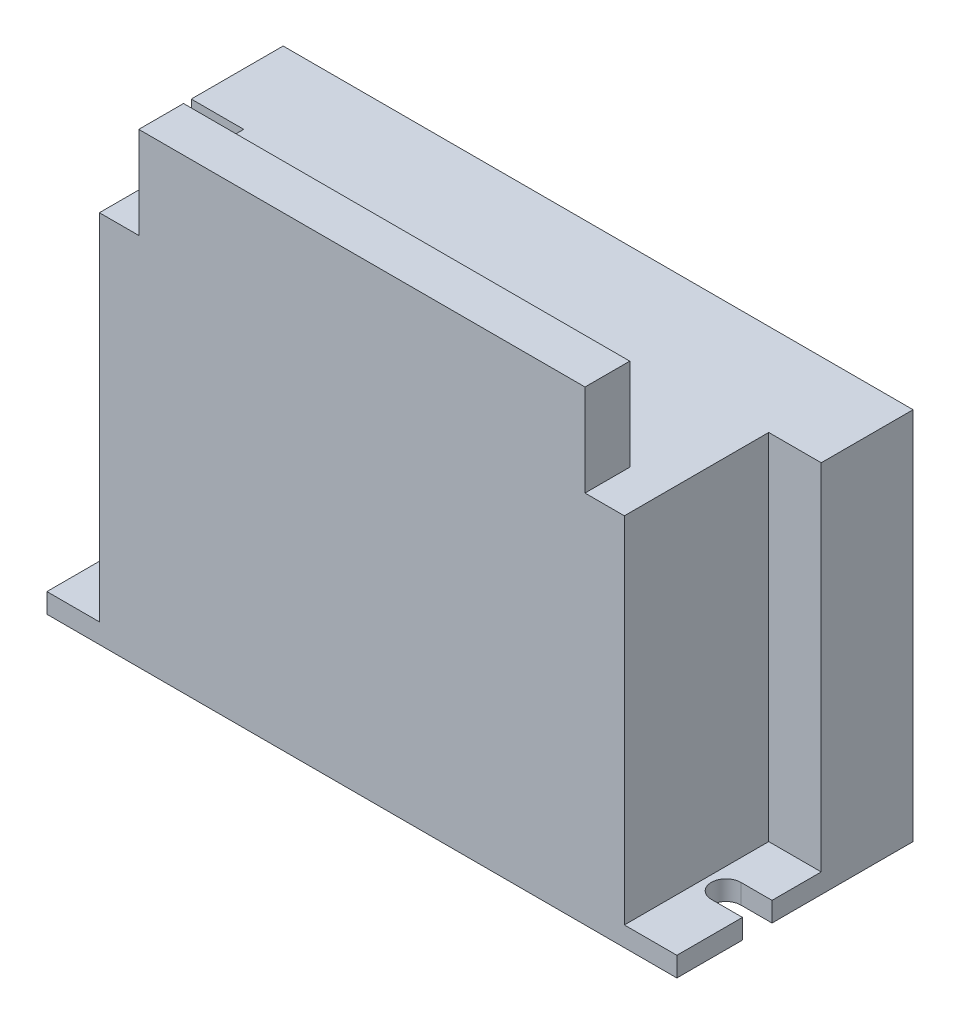
ISO-10303-21;
HEADER;
FILE_DESCRIPTION(('STEP AP214'),'2;1');
FILE_NAME('part.step','',(''),(''),'','','');
FILE_SCHEMA(('AUTOMOTIVE_DESIGN { 1 0 10303 214 1 1 1 1 }'));
ENDSEC;
DATA;
#1=APPLICATION_CONTEXT('core data for automotive mechanical design processes');
#2=APPLICATION_PROTOCOL_DEFINITION('international standard','automotive_design',2000,#1);
#3=PRODUCT_CONTEXT('',#1,'mechanical');
#4=PRODUCT('Part','Part','',(#3));
#5=PRODUCT_RELATED_PRODUCT_CATEGORY('part','',(#4));
#6=PRODUCT_DEFINITION_FORMATION('','',#4);
#7=PRODUCT_DEFINITION_CONTEXT('part definition',#1,'design');
#8=PRODUCT_DEFINITION('design','',#6,#7);
#9=PRODUCT_DEFINITION_SHAPE('','',#8);
#10=(LENGTH_UNIT() NAMED_UNIT(*) SI_UNIT(.MILLI.,.METRE.));
#11=(NAMED_UNIT(*) PLANE_ANGLE_UNIT() SI_UNIT($,.RADIAN.));
#12=(NAMED_UNIT(*) SI_UNIT($,.STERADIAN.) SOLID_ANGLE_UNIT());
#13=UNCERTAINTY_MEASURE_WITH_UNIT(LENGTH_MEASURE(1.E-05),#10,'distance_accuracy_value','');
#14=(GEOMETRIC_REPRESENTATION_CONTEXT(3) GLOBAL_UNCERTAINTY_ASSIGNED_CONTEXT((#13)) GLOBAL_UNIT_ASSIGNED_CONTEXT((#10,
#11,#12)) REPRESENTATION_CONTEXT('',''));
#15=CARTESIAN_POINT('',(0.,0.,0.));
#16=DIRECTION('',(0.,0.,1.));
#17=DIRECTION('',(1.,0.,0.));
#18=AXIS2_PLACEMENT_3D('',#15,#16,#17);
#19=CARTESIAN_POINT('',(-48.,28.5,36.));
#20=DIRECTION('',(0.,-1.,0.));
#21=DIRECTION('',(0.,0.,-1.));
#22=AXIS2_PLACEMENT_3D('',#19,#20,#21);
#23=PLANE('',#22);
#24=DIRECTION('',(0.,0.,-1.));
#25=VECTOR('',#24,1.);
#26=CARTESIAN_POINT('',(34.,28.5,29.1775317753177));
#27=LINE('',#26,#25);
#28=CARTESIAN_POINT('',(34.,28.5,36.));
#29=VERTEX_POINT('',#28);
#30=CARTESIAN_POINT('',(34.,28.5,29.1775317753177));
#31=VERTEX_POINT('',#30);
#32=EDGE_CURVE('E215',#29,#31,#27,.T.);
#33=ORIENTED_EDGE('',*,*,#32,.F.);
#34=DIRECTION('',(-1.,0.,0.));
#35=VECTOR('',#34,1.);
#36=CARTESIAN_POINT('',(-48.,28.5,36.));
#37=LINE('',#36,#35);
#38=CARTESIAN_POINT('',(40.,28.5,36.));
#39=VERTEX_POINT('',#38);
#40=EDGE_CURVE('E366',#39,#29,#37,.T.);
#41=ORIENTED_EDGE('',*,*,#40,.F.);
#42=DIRECTION('',(0.,0.,1.));
#43=VECTOR('',#42,1.);
#44=CARTESIAN_POINT('',(40.,28.5,36.));
#45=LINE('',#44,#43);
#46=CARTESIAN_POINT('',(40.,28.5,14.));
#47=VERTEX_POINT('',#46);
#48=EDGE_CURVE('E341',#47,#39,#45,.T.);
#49=ORIENTED_EDGE('',*,*,#48,.F.);
#50=DIRECTION('',(-1.,0.,0.));
#51=VECTOR('',#50,1.);
#52=CARTESIAN_POINT('',(48.,28.5,14.));
#53=LINE('',#52,#51);
#54=CARTESIAN_POINT('',(48.,28.5,14.));
#55=VERTEX_POINT('',#54);
#56=EDGE_CURVE('E317',#55,#47,#53,.T.);
#57=ORIENTED_EDGE('',*,*,#56,.F.);
#58=DIRECTION('',(0.,0.,-1.));
#59=VECTOR('',#58,1.);
#60=CARTESIAN_POINT('',(48.,28.5,36.));
#61=LINE('',#60,#59);
#62=CARTESIAN_POINT('',(48.,28.5,0.));
#63=VERTEX_POINT('',#62);
#64=EDGE_CURVE('E11',#55,#63,#61,.T.);
#65=ORIENTED_EDGE('',*,*,#64,.T.);
#66=DIRECTION('',(-1.,0.,0.));
#67=VECTOR('',#66,1.);
#68=CARTESIAN_POINT('',(-48.,28.5,0.));
#69=LINE('',#68,#67);
#70=CARTESIAN_POINT('',(-48.,28.5,0.));
#71=VERTEX_POINT('',#70);
#72=EDGE_CURVE('E380',#63,#71,#69,.T.);
#73=ORIENTED_EDGE('',*,*,#72,.T.);
#74=DIRECTION('',(0.,0.,-1.));
#75=VECTOR('',#74,1.);
#76=CARTESIAN_POINT('',(-48.,28.5,36.));
#77=LINE('',#76,#75);
#78=CARTESIAN_POINT('',(-48.,28.5,14.));
#79=VERTEX_POINT('',#78);
#80=EDGE_CURVE('E52',#79,#71,#77,.T.);
#81=ORIENTED_EDGE('',*,*,#80,.F.);
#82=DIRECTION('',(-1.,0.,0.));
#83=VECTOR('',#82,1.);
#84=CARTESIAN_POINT('',(-48.,28.5,14.));
#85=LINE('',#84,#83);
#86=CARTESIAN_POINT('',(-40.,28.5,14.));
#87=VERTEX_POINT('',#86);
#88=EDGE_CURVE('E316',#87,#79,#85,.T.);
#89=ORIENTED_EDGE('',*,*,#88,.F.);
#90=DIRECTION('',(0.,0.,-1.));
#91=VECTOR('',#90,1.);
#92=CARTESIAN_POINT('',(-40.,28.5,36.));
#93=LINE('',#92,#91);
#94=CARTESIAN_POINT('',(-40.,28.5,36.));
#95=VERTEX_POINT('',#94);
#96=EDGE_CURVE('E312',#95,#87,#93,.T.);
#97=ORIENTED_EDGE('',*,*,#96,.F.);
#98=CARTESIAN_POINT('',(-34.,28.5,36.));
#99=VERTEX_POINT('',#98);
#100=EDGE_CURVE('E65',#99,#95,#37,.T.);
#101=ORIENTED_EDGE('',*,*,#100,.F.);
#102=DIRECTION('',(0.,0.,1.));
#103=VECTOR('',#102,1.);
#104=CARTESIAN_POINT('',(-34.,28.5,29.1775317753177));
#105=LINE('',#104,#103);
#106=CARTESIAN_POINT('',(-34.,28.5,29.1775317753177));
#107=VERTEX_POINT('',#106);
#108=EDGE_CURVE('E212',#107,#99,#105,.T.);
#109=ORIENTED_EDGE('',*,*,#108,.F.);
#110=DIRECTION('',(-1.,0.,0.));
#111=VECTOR('',#110,1.);
#112=CARTESIAN_POINT('',(-34.,28.5,29.1775317753177));
#113=LINE('',#112,#111);
#114=EDGE_CURVE('E59',#31,#107,#113,.T.);
#115=ORIENTED_EDGE('',*,*,#114,.F.);
#116=EDGE_LOOP('',(#33,#41,#49,#57,#65,#73,#81,#89,#97,#101,#109,#115));
#117=FACE_BOUND('',#116,.T.);
#118=ADVANCED_FACE('F43',(#117),#23,.F.);
#119=CARTESIAN_POINT('',(-48.,28.5,36.));
#120=DIRECTION('',(1.,0.,0.));
#121=DIRECTION('',(0.,1.,0.));
#122=AXIS2_PLACEMENT_3D('',#119,#120,#121);
#123=PLANE('',#122);
#124=DIRECTION('',(0.,1.,0.));
#125=VECTOR('',#124,1.);
#126=CARTESIAN_POINT('',(-47.9999999999999,-79.5,21.5));
#127=LINE('',#126,#125);
#128=CARTESIAN_POINT('',(-48.,-28.5,21.5));
#129=VERTEX_POINT('',#128);
#130=CARTESIAN_POINT('',(-48.,-25.5,21.5));
#131=VERTEX_POINT('',#130);
#132=EDGE_CURVE('E236',#129,#131,#127,.T.);
#133=ORIENTED_EDGE('',*,*,#132,.T.);
#134=DIRECTION('',(0.,0.,1.));
#135=VECTOR('',#134,1.);
#136=CARTESIAN_POINT('',(-48.,-25.5,36.));
#137=LINE('',#136,#135);
#138=CARTESIAN_POINT('',(-48.,-25.5,14.));
#139=VERTEX_POINT('',#138);
#140=EDGE_CURVE('E294',#139,#131,#137,.T.);
#141=ORIENTED_EDGE('',*,*,#140,.F.);
#142=DIRECTION('',(0.,1.,0.));
#143=VECTOR('',#142,1.);
#144=CARTESIAN_POINT('',(-48.,-25.5,14.));
#145=LINE('',#144,#143);
#146=EDGE_CURVE('E320',#139,#79,#145,.T.);
#147=ORIENTED_EDGE('',*,*,#146,.T.);
#148=ORIENTED_EDGE('',*,*,#80,.T.);
#149=DIRECTION('',(0.,-1.,0.));
#150=VECTOR('',#149,1.);
#151=CARTESIAN_POINT('',(-48.,28.5,0.));
#152=LINE('',#151,#150);
#153=CARTESIAN_POINT('',(-48.,-28.5,0.));
#154=VERTEX_POINT('',#153);
#155=EDGE_CURVE('E384',#71,#154,#152,.T.);
#156=ORIENTED_EDGE('',*,*,#155,.T.);
#157=DIRECTION('',(0.,0.,-1.));
#158=VECTOR('',#157,1.);
#159=CARTESIAN_POINT('',(-48.,-28.5,36.));
#160=LINE('',#159,#158);
#161=EDGE_CURVE('E395',#129,#154,#160,.T.);
#162=ORIENTED_EDGE('',*,*,#161,.F.);
#163=EDGE_LOOP('',(#133,#141,#147,#148,#156,#162));
#164=FACE_BOUND('',#163,.T.);
#165=ADVANCED_FACE('F402',(#164),#123,.F.);
#166=DIRECTION('',(0.,1.,0.));
#167=VECTOR('',#166,1.);
#168=CARTESIAN_POINT('',(-47.9999999999999,-79.5,26.));
#169=LINE('',#168,#167);
#170=CARTESIAN_POINT('',(-48.,-28.5,26.));
#171=VERTEX_POINT('',#170);
#172=CARTESIAN_POINT('',(-48.,-25.5,26.));
#173=VERTEX_POINT('',#172);
#174=EDGE_CURVE('E235',#171,#173,#169,.T.);
#175=ORIENTED_EDGE('',*,*,#174,.F.);
#176=CARTESIAN_POINT('',(-48.,-28.5,36.));
#177=VERTEX_POINT('',#176);
#178=EDGE_CURVE('E396',#177,#171,#160,.T.);
#179=ORIENTED_EDGE('',*,*,#178,.F.);
#180=DIRECTION('',(0.,-1.,0.));
#181=VECTOR('',#180,1.);
#182=CARTESIAN_POINT('',(-48.,28.5,36.));
#183=LINE('',#182,#181);
#184=CARTESIAN_POINT('',(-48.,-25.5,36.));
#185=VERTEX_POINT('',#184);
#186=EDGE_CURVE('E370',#185,#177,#183,.T.);
#187=ORIENTED_EDGE('',*,*,#186,.F.);
#188=EDGE_CURVE('E299',#173,#185,#137,.T.);
#189=ORIENTED_EDGE('',*,*,#188,.F.);
#190=EDGE_LOOP('',(#175,#179,#187,#189));
#191=FACE_BOUND('',#190,.T.);
#192=ADVANCED_FACE('F463',(#191),#123,.F.);
#193=CARTESIAN_POINT('',(-48.,-28.5,36.));
#194=DIRECTION('',(0.,1.,0.));
#195=DIRECTION('',(0.,0.,1.));
#196=AXIS2_PLACEMENT_3D('',#193,#194,#195);
#197=PLANE('',#196);
#198=DIRECTION('',(1.,0.,0.));
#199=VECTOR('',#198,1.);
#200=CARTESIAN_POINT('',(-48.,-28.5,21.5));
#201=LINE('',#200,#199);
#202=CARTESIAN_POINT('',(-43.25,-28.5,21.5));
#203=VERTEX_POINT('',#202);
#204=EDGE_CURVE('E254',#129,#203,#201,.T.);
#205=ORIENTED_EDGE('',*,*,#204,.F.);
#206=ORIENTED_EDGE('',*,*,#161,.T.);
#207=DIRECTION('',(1.,0.,0.));
#208=VECTOR('',#207,1.);
#209=CARTESIAN_POINT('',(-48.,-28.5,0.));
#210=LINE('',#209,#208);
#211=CARTESIAN_POINT('',(48.,-28.5,0.));
#212=VERTEX_POINT('',#211);
#213=EDGE_CURVE('E365',#154,#212,#210,.T.);
#214=ORIENTED_EDGE('',*,*,#213,.T.);
#215=DIRECTION('',(0.,0.,-1.));
#216=VECTOR('',#215,1.);
#217=CARTESIAN_POINT('',(48.,-28.5,36.));
#218=LINE('',#217,#216);
#219=CARTESIAN_POINT('',(48.,-28.5,21.5));
#220=VERTEX_POINT('',#219);
#221=EDGE_CURVE('E376',#220,#212,#218,.T.);
#222=ORIENTED_EDGE('',*,*,#221,.F.);
#223=DIRECTION('',(-1.,0.,0.));
#224=VECTOR('',#223,1.);
#225=CARTESIAN_POINT('',(-48.,-28.5,21.4999999999999));
#226=LINE('',#225,#224);
#227=CARTESIAN_POINT('',(43.25,-28.5,21.5));
#228=VERTEX_POINT('',#227);
#229=EDGE_CURVE('E273',#220,#228,#226,.T.);
#230=ORIENTED_EDGE('',*,*,#229,.T.);
#231=CARTESIAN_POINT('',(43.25,-28.5,23.75));
#232=DIRECTION('',(0.,1.,0.));
#233=DIRECTION('',(0.,0.,1.));
#234=AXIS2_PLACEMENT_3D('',#231,#232,#233);
#235=CIRCLE('',#234,2.25);
#236=CARTESIAN_POINT('',(43.25,-28.5,26.));
#237=VERTEX_POINT('',#236);
#238=EDGE_CURVE('E285',#228,#237,#235,.T.);
#239=ORIENTED_EDGE('',*,*,#238,.T.);
#240=DIRECTION('',(1.,0.,0.));
#241=VECTOR('',#240,1.);
#242=CARTESIAN_POINT('',(-48.,-28.5,26.));
#243=LINE('',#242,#241);
#244=CARTESIAN_POINT('',(48.,-28.5,26.));
#245=VERTEX_POINT('',#244);
#246=EDGE_CURVE('E289',#237,#245,#243,.T.);
#247=ORIENTED_EDGE('',*,*,#246,.T.);
#248=CARTESIAN_POINT('',(48.,-28.5,36.));
#249=VERTEX_POINT('',#248);
#250=EDGE_CURVE('E391',#249,#245,#218,.T.);
#251=ORIENTED_EDGE('',*,*,#250,.F.);
#252=DIRECTION('',(1.,0.,0.));
#253=VECTOR('',#252,1.);
#254=CARTESIAN_POINT('',(-48.,-28.5,36.));
#255=LINE('',#254,#253);
#256=EDGE_CURVE('E373',#177,#249,#255,.T.);
#257=ORIENTED_EDGE('',*,*,#256,.F.);
#258=ORIENTED_EDGE('',*,*,#178,.T.);
#259=DIRECTION('',(-1.,0.,0.));
#260=VECTOR('',#259,1.);
#261=CARTESIAN_POINT('',(-48.,-28.5,26.));
#262=LINE('',#261,#260);
#263=CARTESIAN_POINT('',(-43.25,-28.5,26.));
#264=VERTEX_POINT('',#263);
#265=EDGE_CURVE('E240',#264,#171,#262,.T.);
#266=ORIENTED_EDGE('',*,*,#265,.F.);
#267=CARTESIAN_POINT('',(-43.25,-28.5,23.75));
#268=DIRECTION('',(0.,1.,0.));
#269=DIRECTION('',(0.,0.,1.));
#270=AXIS2_PLACEMENT_3D('',#267,#268,#269);
#271=CIRCLE('',#270,2.25);
#272=EDGE_CURVE('E251',#203,#264,#271,.F.);
#273=ORIENTED_EDGE('',*,*,#272,.F.);
#274=EDGE_LOOP('',(#205,#206,#214,#222,#230,#239,#247,#251,#257,#258,#266,#273));
#275=FACE_BOUND('',#274,.T.);
#276=ADVANCED_FACE('F417',(#275),#197,.F.);
#277=CARTESIAN_POINT('',(0.,-25.5,0.));
#278=DIRECTION('',(0.,-1.,0.));
#279=DIRECTION('',(0.,0.,-1.));
#280=AXIS2_PLACEMENT_3D('',#277,#278,#279);
#281=PLANE('',#280);
#282=DIRECTION('',(1.,0.,0.));
#283=VECTOR('',#282,1.);
#284=CARTESIAN_POINT('',(-48.,-25.5,21.5));
#285=LINE('',#284,#283);
#286=CARTESIAN_POINT('',(-43.25,-25.5,21.5));
#287=VERTEX_POINT('',#286);
#288=EDGE_CURVE('E231',#131,#287,#285,.T.);
#289=ORIENTED_EDGE('',*,*,#288,.T.);
#290=CARTESIAN_POINT('',(-43.25,-25.5,23.75));
#291=DIRECTION('',(0.,-1.,0.));
#292=DIRECTION('',(0.,0.,1.));
#293=AXIS2_PLACEMENT_3D('',#290,#291,#292);
#294=CIRCLE('',#293,2.25);
#295=CARTESIAN_POINT('',(-43.25,-25.5,26.));
#296=VERTEX_POINT('',#295);
#297=EDGE_CURVE('E222',#287,#296,#294,.T.);
#298=ORIENTED_EDGE('',*,*,#297,.T.);
#299=DIRECTION('',(-1.,0.,0.));
#300=VECTOR('',#299,1.);
#301=CARTESIAN_POINT('',(-48.,-25.5,26.));
#302=LINE('',#301,#300);
#303=EDGE_CURVE('E217',#296,#173,#302,.T.);
#304=ORIENTED_EDGE('',*,*,#303,.T.);
#305=ORIENTED_EDGE('',*,*,#188,.T.);
#306=DIRECTION('',(1.,0.,0.));
#307=VECTOR('',#306,1.);
#308=CARTESIAN_POINT('',(-48.,-25.5,36.));
#309=LINE('',#308,#307);
#310=CARTESIAN_POINT('',(-40.,-25.5,36.));
#311=VERTEX_POINT('',#310);
#312=EDGE_CURVE('E298',#185,#311,#309,.T.);
#313=ORIENTED_EDGE('',*,*,#312,.T.);
#314=DIRECTION('',(0.,0.,-1.));
#315=VECTOR('',#314,1.);
#316=CARTESIAN_POINT('',(-40.,-25.5,36.));
#317=LINE('',#316,#315);
#318=CARTESIAN_POINT('',(-40.,-25.5,14.));
#319=VERTEX_POINT('',#318);
#320=EDGE_CURVE('E303',#311,#319,#317,.T.);
#321=ORIENTED_EDGE('',*,*,#320,.T.);
#322=DIRECTION('',(-1.,0.,0.));
#323=VECTOR('',#322,1.);
#324=CARTESIAN_POINT('',(-48.,-25.5,14.));
#325=LINE('',#324,#323);
#326=EDGE_CURVE('E307',#319,#139,#325,.T.);
#327=ORIENTED_EDGE('',*,*,#326,.T.);
#328=ORIENTED_EDGE('',*,*,#140,.T.);
#329=EDGE_LOOP('',(#289,#298,#304,#305,#313,#321,#327,#328));
#330=FACE_BOUND('',#329,.T.);
#331=ADVANCED_FACE('F470',(#330),#281,.F.);
#332=CARTESIAN_POINT('',(48.,28.5,36.));
#333=DIRECTION('',(-1.,0.,0.));
#334=DIRECTION('',(0.,-1.,0.));
#335=AXIS2_PLACEMENT_3D('',#332,#333,#334);
#336=PLANE('',#335);
#337=ORIENTED_EDGE('',*,*,#250,.T.);
#338=DIRECTION('',(0.,1.,0.));
#339=VECTOR('',#338,1.);
#340=CARTESIAN_POINT('',(48.,-79.5,26.));
#341=LINE('',#340,#339);
#342=CARTESIAN_POINT('',(48.,-25.5,26.));
#343=VERTEX_POINT('',#342);
#344=EDGE_CURVE('E269',#245,#343,#341,.T.);
#345=ORIENTED_EDGE('',*,*,#344,.T.);
#346=DIRECTION('',(0.,0.,-1.));
#347=VECTOR('',#346,1.);
#348=CARTESIAN_POINT('',(48.,-25.5,36.));
#349=LINE('',#348,#347);
#350=CARTESIAN_POINT('',(48.,-25.5,36.));
#351=VERTEX_POINT('',#350);
#352=EDGE_CURVE('E344',#351,#343,#349,.T.);
#353=ORIENTED_EDGE('',*,*,#352,.F.);
#354=DIRECTION('',(0.,1.,0.));
#355=VECTOR('',#354,1.);
#356=CARTESIAN_POINT('',(48.,28.5,36.));
#357=LINE('',#356,#355);
#358=EDGE_CURVE('E361',#249,#351,#357,.T.);
#359=ORIENTED_EDGE('',*,*,#358,.F.);
#360=EDGE_LOOP('',(#337,#345,#353,#359));
#361=FACE_BOUND('',#360,.T.);
#362=ADVANCED_FACE('F448',(#361),#336,.F.);
#363=CARTESIAN_POINT('',(48.,-25.5,21.5));
#364=VERTEX_POINT('',#363);
#365=CARTESIAN_POINT('',(48.,-25.5,14.));
#366=VERTEX_POINT('',#365);
#367=EDGE_CURVE('E357',#364,#366,#349,.T.);
#368=ORIENTED_EDGE('',*,*,#367,.F.);
#369=DIRECTION('',(0.,1.,0.));
#370=VECTOR('',#369,1.);
#371=CARTESIAN_POINT('',(48.,-79.5,21.5));
#372=LINE('',#371,#370);
#373=EDGE_CURVE('E268',#220,#364,#372,.T.);
#374=ORIENTED_EDGE('',*,*,#373,.F.);
#375=ORIENTED_EDGE('',*,*,#221,.T.);
#376=DIRECTION('',(0.,1.,0.));
#377=VECTOR('',#376,1.);
#378=CARTESIAN_POINT('',(48.,28.5,0.));
#379=LINE('',#378,#377);
#380=EDGE_CURVE('E324',#212,#63,#379,.T.);
#381=ORIENTED_EDGE('',*,*,#380,.T.);
#382=ORIENTED_EDGE('',*,*,#64,.F.);
#383=DIRECTION('',(0.,1.,0.));
#384=VECTOR('',#383,1.);
#385=CARTESIAN_POINT('',(48.,-25.5,14.));
#386=LINE('',#385,#384);
#387=EDGE_CURVE('E331',#366,#55,#386,.T.);
#388=ORIENTED_EDGE('',*,*,#387,.F.);
#389=EDGE_LOOP('',(#368,#374,#375,#381,#382,#388));
#390=FACE_BOUND('',#389,.T.);
#391=ADVANCED_FACE('F45',(#390),#336,.F.);
#392=CARTESIAN_POINT('',(0.,0.,36.));
#393=DIRECTION('',(0.,0.,1.));
#394=DIRECTION('',(1.,0.,0.));
#395=AXIS2_PLACEMENT_3D('',#392,#393,#394);
#396=PLANE('',#395);
#397=DIRECTION('',(0.,1.,0.));
#398=VECTOR('',#397,1.);
#399=CARTESIAN_POINT('',(-40.,-25.5,36.));
#400=LINE('',#399,#398);
#401=EDGE_CURVE('E311',#311,#95,#400,.T.);
#402=ORIENTED_EDGE('',*,*,#401,.F.);
#403=ORIENTED_EDGE('',*,*,#312,.F.);
#404=ORIENTED_EDGE('',*,*,#186,.T.);
#405=ORIENTED_EDGE('',*,*,#256,.T.);
#406=ORIENTED_EDGE('',*,*,#358,.T.);
#407=DIRECTION('',(1.,0.,0.));
#408=VECTOR('',#407,1.);
#409=CARTESIAN_POINT('',(48.,-25.5,36.));
#410=LINE('',#409,#408);
#411=CARTESIAN_POINT('',(40.,-25.5,36.));
#412=VERTEX_POINT('',#411);
#413=EDGE_CURVE('E334',#412,#351,#410,.T.);
#414=ORIENTED_EDGE('',*,*,#413,.F.);
#415=DIRECTION('',(0.,1.,0.));
#416=VECTOR('',#415,1.);
#417=CARTESIAN_POINT('',(40.,-25.5,36.));
#418=LINE('',#417,#416);
#419=EDGE_CURVE('E293',#412,#39,#418,.T.);
#420=ORIENTED_EDGE('',*,*,#419,.T.);
#421=ORIENTED_EDGE('',*,*,#40,.T.);
#422=DIRECTION('',(0.,-1.,0.));
#423=VECTOR('',#422,1.);
#424=CARTESIAN_POINT('',(34.,42.5,36.));
#425=LINE('',#424,#423);
#426=CARTESIAN_POINT('',(34.,42.5,36.));
#427=VERTEX_POINT('',#426);
#428=EDGE_CURVE('E486',#427,#29,#425,.T.);
#429=ORIENTED_EDGE('',*,*,#428,.F.);
#430=DIRECTION('',(1.,0.,0.));
#431=VECTOR('',#430,1.);
#432=CARTESIAN_POINT('',(-34.,42.5,36.));
#433=LINE('',#432,#431);
#434=CARTESIAN_POINT('',(-34.,42.5,36.));
#435=VERTEX_POINT('',#434);
#436=EDGE_CURVE('E207',#435,#427,#433,.T.);
#437=ORIENTED_EDGE('',*,*,#436,.F.);
#438=DIRECTION('',(0.,-1.,0.));
#439=VECTOR('',#438,1.);
#440=CARTESIAN_POINT('',(-34.,42.5,36.));
#441=LINE('',#440,#439);
#442=EDGE_CURVE('E224',#435,#99,#441,.T.);
#443=ORIENTED_EDGE('',*,*,#442,.T.);
#444=ORIENTED_EDGE('',*,*,#100,.T.);
#445=EDGE_LOOP('',(#402,#403,#404,#405,#406,#414,#420,#421,#429,#437,#443,#444));
#446=FACE_BOUND('',#445,.T.);
#447=ADVANCED_FACE('F454',(#446),#396,.T.);
#448=CARTESIAN_POINT('',(0.,0.,0.));
#449=DIRECTION('',(0.,0.,1.));
#450=DIRECTION('',(1.,0.,0.));
#451=AXIS2_PLACEMENT_3D('',#448,#449,#450);
#452=PLANE('',#451);
#453=ORIENTED_EDGE('',*,*,#380,.F.);
#454=ORIENTED_EDGE('',*,*,#213,.F.);
#455=ORIENTED_EDGE('',*,*,#155,.F.);
#456=ORIENTED_EDGE('',*,*,#72,.F.);
#457=EDGE_LOOP('',(#453,#454,#455,#456));
#458=FACE_BOUND('',#457,.T.);
#459=ADVANCED_FACE('F413',(#458),#452,.F.);
#460=CARTESIAN_POINT('',(40.,-25.5,36.));
#461=DIRECTION('',(-1.,0.,0.));
#462=DIRECTION('',(0.,0.,1.));
#463=AXIS2_PLACEMENT_3D('',#460,#461,#462);
#464=PLANE('',#463);
#465=ORIENTED_EDGE('',*,*,#48,.T.);
#466=ORIENTED_EDGE('',*,*,#419,.F.);
#467=DIRECTION('',(0.,0.,1.));
#468=VECTOR('',#467,1.);
#469=CARTESIAN_POINT('',(40.,-25.5,36.));
#470=LINE('',#469,#468);
#471=CARTESIAN_POINT('',(40.,-25.5,14.));
#472=VERTEX_POINT('',#471);
#473=EDGE_CURVE('E350',#472,#412,#470,.T.);
#474=ORIENTED_EDGE('',*,*,#473,.F.);
#475=DIRECTION('',(0.,1.,0.));
#476=VECTOR('',#475,1.);
#477=CARTESIAN_POINT('',(40.,-25.5,14.));
#478=LINE('',#477,#476);
#479=EDGE_CURVE('E335',#472,#47,#478,.T.);
#480=ORIENTED_EDGE('',*,*,#479,.T.);
#481=EDGE_LOOP('',(#465,#466,#474,#480));
#482=FACE_BOUND('',#481,.T.);
#483=ADVANCED_FACE('F518',(#482),#464,.F.);
#484=CARTESIAN_POINT('',(48.,-25.5,14.));
#485=DIRECTION('',(0.,0.,-1.));
#486=DIRECTION('',(-1.,0.,0.));
#487=AXIS2_PLACEMENT_3D('',#484,#485,#486);
#488=PLANE('',#487);
#489=ORIENTED_EDGE('',*,*,#56,.T.);
#490=ORIENTED_EDGE('',*,*,#479,.F.);
#491=DIRECTION('',(-1.,0.,0.));
#492=VECTOR('',#491,1.);
#493=CARTESIAN_POINT('',(48.,-25.5,14.));
#494=LINE('',#493,#492);
#495=EDGE_CURVE('E353',#366,#472,#494,.T.);
#496=ORIENTED_EDGE('',*,*,#495,.F.);
#497=ORIENTED_EDGE('',*,*,#387,.T.);
#498=EDGE_LOOP('',(#489,#490,#496,#497));
#499=FACE_BOUND('',#498,.T.);
#500=ADVANCED_FACE('F435',(#499),#488,.F.);
#501=CARTESIAN_POINT('',(0.,-25.5,0.));
#502=DIRECTION('',(0.,1.,0.));
#503=DIRECTION('',(0.,0.,1.));
#504=AXIS2_PLACEMENT_3D('',#501,#502,#503);
#505=PLANE('',#504);
#506=DIRECTION('',(1.,0.,0.));
#507=VECTOR('',#506,1.);
#508=CARTESIAN_POINT('',(48.,-25.5,26.));
#509=LINE('',#508,#507);
#510=CARTESIAN_POINT('',(43.25,-25.5,26.));
#511=VERTEX_POINT('',#510);
#512=EDGE_CURVE('E265',#511,#343,#509,.T.);
#513=ORIENTED_EDGE('',*,*,#512,.F.);
#514=CARTESIAN_POINT('',(43.25,-25.5,23.75));
#515=DIRECTION('',(0.,1.,0.));
#516=DIRECTION('',(0.,0.,1.));
#517=AXIS2_PLACEMENT_3D('',#514,#515,#516);
#518=CIRCLE('',#517,2.25);
#519=CARTESIAN_POINT('',(43.25,-25.5,21.5));
#520=VERTEX_POINT('',#519);
#521=EDGE_CURVE('E261',#520,#511,#518,.T.);
#522=ORIENTED_EDGE('',*,*,#521,.F.);
#523=DIRECTION('',(-1.,0.,0.));
#524=VECTOR('',#523,1.);
#525=CARTESIAN_POINT('',(48.,-25.5,21.5));
#526=LINE('',#525,#524);
#527=EDGE_CURVE('E257',#364,#520,#526,.T.);
#528=ORIENTED_EDGE('',*,*,#527,.F.);
#529=ORIENTED_EDGE('',*,*,#367,.T.);
#530=ORIENTED_EDGE('',*,*,#495,.T.);
#531=ORIENTED_EDGE('',*,*,#473,.T.);
#532=ORIENTED_EDGE('',*,*,#413,.T.);
#533=ORIENTED_EDGE('',*,*,#352,.T.);
#534=EDGE_LOOP('',(#513,#522,#528,#529,#530,#531,#532,#533));
#535=FACE_BOUND('',#534,.T.);
#536=ADVANCED_FACE('F429',(#535),#505,.T.);
#537=CARTESIAN_POINT('',(-48.,-25.5,14.));
#538=DIRECTION('',(0.,0.,-1.));
#539=DIRECTION('',(-1.,0.,0.));
#540=AXIS2_PLACEMENT_3D('',#537,#538,#539);
#541=PLANE('',#540);
#542=ORIENTED_EDGE('',*,*,#88,.T.);
#543=ORIENTED_EDGE('',*,*,#146,.F.);
#544=ORIENTED_EDGE('',*,*,#326,.F.);
#545=DIRECTION('',(0.,1.,0.));
#546=VECTOR('',#545,1.);
#547=CARTESIAN_POINT('',(-40.,-25.5,14.));
#548=LINE('',#547,#546);
#549=EDGE_CURVE('E325',#319,#87,#548,.T.);
#550=ORIENTED_EDGE('',*,*,#549,.T.);
#551=EDGE_LOOP('',(#542,#543,#544,#550));
#552=FACE_BOUND('',#551,.T.);
#553=ADVANCED_FACE('F479',(#552),#541,.F.);
#554=CARTESIAN_POINT('',(-40.,-25.5,36.));
#555=DIRECTION('',(1.,0.,0.));
#556=DIRECTION('',(0.,0.,-1.));
#557=AXIS2_PLACEMENT_3D('',#554,#555,#556);
#558=PLANE('',#557);
#559=ORIENTED_EDGE('',*,*,#96,.T.);
#560=ORIENTED_EDGE('',*,*,#549,.F.);
#561=ORIENTED_EDGE('',*,*,#320,.F.);
#562=ORIENTED_EDGE('',*,*,#401,.T.);
#563=EDGE_LOOP('',(#559,#560,#561,#562));
#564=FACE_BOUND('',#563,.T.);
#565=ADVANCED_FACE('F481',(#564),#558,.F.);
#566=CARTESIAN_POINT('',(48.,-79.5,26.));
#567=DIRECTION('',(0.,0.,1.));
#568=DIRECTION('',(1.,0.,0.));
#569=AXIS2_PLACEMENT_3D('',#566,#567,#568);
#570=PLANE('',#569);
#571=DIRECTION('',(0.,1.,0.));
#572=VECTOR('',#571,1.);
#573=CARTESIAN_POINT('',(43.25,-79.5,26.));
#574=LINE('',#573,#572);
#575=EDGE_CURVE('E274',#237,#511,#574,.T.);
#576=ORIENTED_EDGE('',*,*,#575,.T.);
#577=ORIENTED_EDGE('',*,*,#512,.T.);
#578=ORIENTED_EDGE('',*,*,#344,.F.);
#579=ORIENTED_EDGE('',*,*,#246,.F.);
#580=EDGE_LOOP('',(#576,#577,#578,#579));
#581=FACE_BOUND('',#580,.T.);
#582=ADVANCED_FACE('F445',(#581),#570,.F.);
#583=CARTESIAN_POINT('',(43.25,-79.5,23.75));
#584=DIRECTION('',(0.,1.,0.));
#585=DIRECTION('',(0.,0.,1.));
#586=AXIS2_PLACEMENT_3D('',#583,#584,#585);
#587=CYLINDRICAL_SURFACE('',#586,2.25);
#588=DIRECTION('',(0.,1.,0.));
#589=VECTOR('',#588,1.);
#590=CARTESIAN_POINT('',(43.25,-79.5,21.5));
#591=LINE('',#590,#589);
#592=EDGE_CURVE('E277',#228,#520,#591,.T.);
#593=ORIENTED_EDGE('',*,*,#592,.T.);
#594=ORIENTED_EDGE('',*,*,#521,.T.);
#595=ORIENTED_EDGE('',*,*,#575,.F.);
#596=ORIENTED_EDGE('',*,*,#238,.F.);
#597=EDGE_LOOP('',(#593,#594,#595,#596));
#598=FACE_BOUND('',#597,.T.);
#599=ADVANCED_FACE('F443',(#598),#587,.F.);
#600=CARTESIAN_POINT('',(48.,-79.5,21.5));
#601=DIRECTION('',(0.,0.,-1.));
#602=DIRECTION('',(-1.,0.,0.));
#603=AXIS2_PLACEMENT_3D('',#600,#601,#602);
#604=PLANE('',#603);
#605=ORIENTED_EDGE('',*,*,#373,.T.);
#606=ORIENTED_EDGE('',*,*,#527,.T.);
#607=ORIENTED_EDGE('',*,*,#592,.F.);
#608=ORIENTED_EDGE('',*,*,#229,.F.);
#609=EDGE_LOOP('',(#605,#606,#607,#608));
#610=FACE_BOUND('',#609,.T.);
#611=ADVANCED_FACE('F438',(#610),#604,.F.);
#612=CARTESIAN_POINT('',(-47.9999999999999,-79.5,21.5));
#613=DIRECTION('',(0.,0.,1.));
#614=DIRECTION('',(1.,0.,0.));
#615=AXIS2_PLACEMENT_3D('',#612,#613,#614);
#616=PLANE('',#615);
#617=ORIENTED_EDGE('',*,*,#204,.T.);
#618=DIRECTION('',(0.,1.,0.));
#619=VECTOR('',#618,1.);
#620=CARTESIAN_POINT('',(-43.2499999999999,-79.5,21.5));
#621=LINE('',#620,#619);
#622=EDGE_CURVE('E241',#203,#287,#621,.T.);
#623=ORIENTED_EDGE('',*,*,#622,.T.);
#624=ORIENTED_EDGE('',*,*,#288,.F.);
#625=ORIENTED_EDGE('',*,*,#132,.F.);
#626=EDGE_LOOP('',(#617,#623,#624,#625));
#627=FACE_BOUND('',#626,.T.);
#628=ADVANCED_FACE('F476',(#627),#616,.T.);
#629=CARTESIAN_POINT('',(-43.2499999999999,-79.5,23.75));
#630=DIRECTION('',(0.,1.,0.));
#631=DIRECTION('',(-1.,0.,0.));
#632=AXIS2_PLACEMENT_3D('',#629,#630,#631);
#633=CYLINDRICAL_SURFACE('',#632,2.25);
#634=ORIENTED_EDGE('',*,*,#272,.T.);
#635=DIRECTION('',(0.,1.,0.));
#636=VECTOR('',#635,1.);
#637=CARTESIAN_POINT('',(-43.2499999999999,-79.5,26.));
#638=LINE('',#637,#636);
#639=EDGE_CURVE('E244',#264,#296,#638,.T.);
#640=ORIENTED_EDGE('',*,*,#639,.T.);
#641=ORIENTED_EDGE('',*,*,#297,.F.);
#642=ORIENTED_EDGE('',*,*,#622,.F.);
#643=EDGE_LOOP('',(#634,#640,#641,#642));
#644=FACE_BOUND('',#643,.T.);
#645=ADVANCED_FACE('F474',(#644),#633,.F.);
#646=CARTESIAN_POINT('',(-47.9999999999999,-79.5,26.));
#647=DIRECTION('',(0.,0.,-1.));
#648=DIRECTION('',(-1.,0.,0.));
#649=AXIS2_PLACEMENT_3D('',#646,#647,#648);
#650=PLANE('',#649);
#651=ORIENTED_EDGE('',*,*,#265,.T.);
#652=ORIENTED_EDGE('',*,*,#174,.T.);
#653=ORIENTED_EDGE('',*,*,#303,.F.);
#654=ORIENTED_EDGE('',*,*,#639,.F.);
#655=EDGE_LOOP('',(#651,#652,#653,#654));
#656=FACE_BOUND('',#655,.T.);
#657=ADVANCED_FACE('F467',(#656),#650,.T.);
#658=CARTESIAN_POINT('',(34.,42.5,29.1775317753177));
#659=DIRECTION('',(-1.,0.,0.));
#660=DIRECTION('',(0.,0.,1.));
#661=AXIS2_PLACEMENT_3D('',#658,#659,#660);
#662=PLANE('',#661);
#663=ORIENTED_EDGE('',*,*,#32,.T.);
#664=DIRECTION('',(0.,-1.,0.));
#665=VECTOR('',#664,1.);
#666=CARTESIAN_POINT('',(34.,42.5,29.1775317753177));
#667=LINE('',#666,#665);
#668=CARTESIAN_POINT('',(34.,42.5,29.1775317753177));
#669=VERTEX_POINT('',#668);
#670=EDGE_CURVE('E194',#669,#31,#667,.T.);
#671=ORIENTED_EDGE('',*,*,#670,.F.);
#672=DIRECTION('',(0.,0.,-1.));
#673=VECTOR('',#672,1.);
#674=CARTESIAN_POINT('',(34.,42.5,29.1775317753177));
#675=LINE('',#674,#673);
#676=EDGE_CURVE('E202',#427,#669,#675,.T.);
#677=ORIENTED_EDGE('',*,*,#676,.F.);
#678=ORIENTED_EDGE('',*,*,#428,.T.);
#679=EDGE_LOOP('',(#663,#671,#677,#678));
#680=FACE_BOUND('',#679,.T.);
#681=ADVANCED_FACE('F214',(#680),#662,.F.);
#682=CARTESIAN_POINT('',(-34.,42.5,29.1775317753177));
#683=DIRECTION('',(0.,0.,1.));
#684=DIRECTION('',(1.,0.,0.));
#685=AXIS2_PLACEMENT_3D('',#682,#683,#684);
#686=PLANE('',#685);
#687=ORIENTED_EDGE('',*,*,#114,.T.);
#688=DIRECTION('',(0.,-1.,0.));
#689=VECTOR('',#688,1.);
#690=CARTESIAN_POINT('',(-34.,42.5,29.1775317753177));
#691=LINE('',#690,#689);
#692=CARTESIAN_POINT('',(-34.,42.5,29.1775317753177));
#693=VERTEX_POINT('',#692);
#694=EDGE_CURVE('E197',#693,#107,#691,.T.);
#695=ORIENTED_EDGE('',*,*,#694,.F.);
#696=DIRECTION('',(-1.,0.,0.));
#697=VECTOR('',#696,1.);
#698=CARTESIAN_POINT('',(-34.,42.5,29.1775317753177));
#699=LINE('',#698,#697);
#700=EDGE_CURVE('E190',#669,#693,#699,.T.);
#701=ORIENTED_EDGE('',*,*,#700,.F.);
#702=ORIENTED_EDGE('',*,*,#670,.T.);
#703=EDGE_LOOP('',(#687,#695,#701,#702));
#704=FACE_BOUND('',#703,.T.);
#705=ADVANCED_FACE('F192',(#704),#686,.F.);
#706=CARTESIAN_POINT('',(-34.,42.5,29.1775317753177));
#707=DIRECTION('',(1.,0.,0.));
#708=DIRECTION('',(0.,0.,-1.));
#709=AXIS2_PLACEMENT_3D('',#706,#707,#708);
#710=PLANE('',#709);
#711=ORIENTED_EDGE('',*,*,#108,.T.);
#712=ORIENTED_EDGE('',*,*,#442,.F.);
#713=DIRECTION('',(0.,0.,1.));
#714=VECTOR('',#713,1.);
#715=CARTESIAN_POINT('',(-34.,42.5,29.1775317753177));
#716=LINE('',#715,#714);
#717=EDGE_CURVE('E201',#693,#435,#716,.T.);
#718=ORIENTED_EDGE('',*,*,#717,.F.);
#719=ORIENTED_EDGE('',*,*,#694,.T.);
#720=EDGE_LOOP('',(#711,#712,#718,#719));
#721=FACE_BOUND('',#720,.T.);
#722=ADVANCED_FACE('F499',(#721),#710,.F.);
#723=CARTESIAN_POINT('',(0.,42.5,0.));
#724=DIRECTION('',(0.,1.,0.));
#725=DIRECTION('',(0.,0.,1.));
#726=AXIS2_PLACEMENT_3D('',#723,#724,#725);
#727=PLANE('',#726);
#728=ORIENTED_EDGE('',*,*,#676,.T.);
#729=ORIENTED_EDGE('',*,*,#700,.T.);
#730=ORIENTED_EDGE('',*,*,#717,.T.);
#731=ORIENTED_EDGE('',*,*,#436,.T.);
#732=EDGE_LOOP('',(#728,#729,#730,#731));
#733=FACE_BOUND('',#732,.T.);
#734=ADVANCED_FACE('F205',(#733),#727,.T.);
#735=CLOSED_SHELL('',(#118,#165,#192,#276,#331,#362,#391,#447,#459,#483,#500,#536,#553,#565,
#582,#599,#611,#628,#645,#657,#681,#705,#722,#734));
#736=MANIFOLD_SOLID_BREP('B2',#735);
#737=ADVANCED_BREP_SHAPE_REPRESENTATION('',(#18,#736),#14);
#738=SHAPE_DEFINITION_REPRESENTATION(#9,#737);
ENDSEC;
END-ISO-10303-21;
